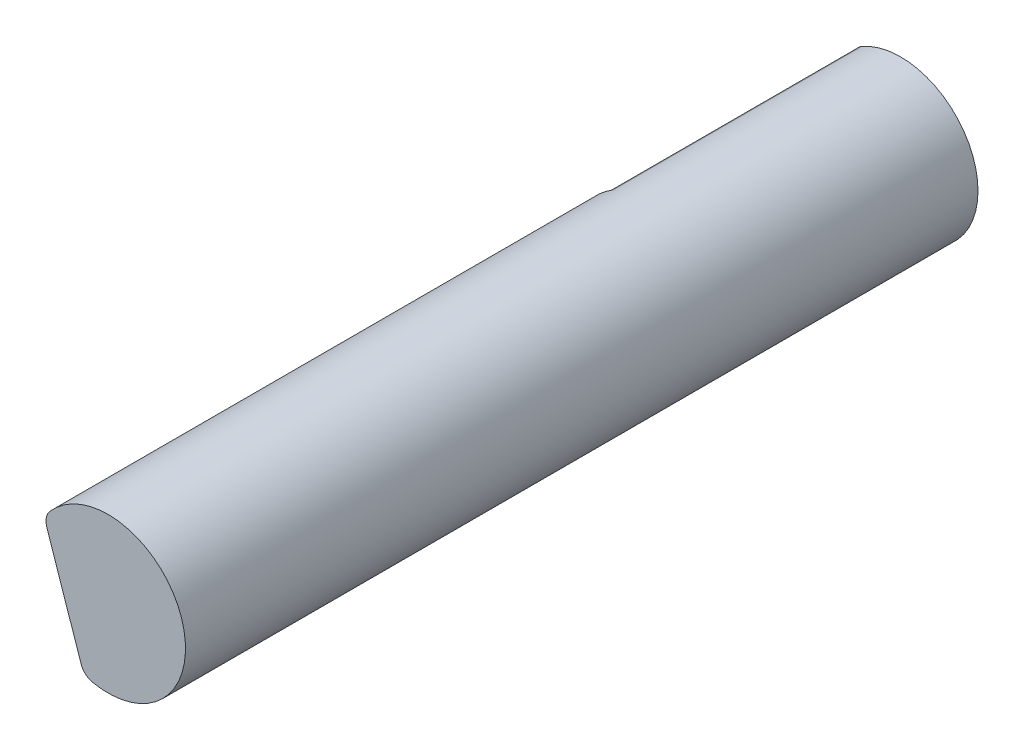
ISO-10303-21;
HEADER;
FILE_DESCRIPTION(('STEP AP214'),'2;1');
FILE_NAME('part.step','',(''),(''),'','','');
FILE_SCHEMA(('AUTOMOTIVE_DESIGN { 1 0 10303 214 1 1 1 1 }'));
ENDSEC;
DATA;
#1=APPLICATION_CONTEXT('core data for automotive mechanical design processes');
#2=APPLICATION_PROTOCOL_DEFINITION('international standard','automotive_design',2000,#1);
#3=PRODUCT_CONTEXT('',#1,'mechanical');
#4=PRODUCT('Part','Part','',(#3));
#5=PRODUCT_RELATED_PRODUCT_CATEGORY('part','',(#4));
#6=PRODUCT_DEFINITION_FORMATION('','',#4);
#7=PRODUCT_DEFINITION_CONTEXT('part definition',#1,'design');
#8=PRODUCT_DEFINITION('design','',#6,#7);
#9=PRODUCT_DEFINITION_SHAPE('','',#8);
#10=(LENGTH_UNIT() NAMED_UNIT(*) SI_UNIT(.MILLI.,.METRE.));
#11=(NAMED_UNIT(*) PLANE_ANGLE_UNIT() SI_UNIT($,.RADIAN.));
#12=(NAMED_UNIT(*) SI_UNIT($,.STERADIAN.) SOLID_ANGLE_UNIT());
#13=UNCERTAINTY_MEASURE_WITH_UNIT(LENGTH_MEASURE(1.E-05),#10,'distance_accuracy_value','');
#14=(GEOMETRIC_REPRESENTATION_CONTEXT(3) GLOBAL_UNCERTAINTY_ASSIGNED_CONTEXT((#13)) GLOBAL_UNIT_ASSIGNED_CONTEXT((#10,
#11,#12)) REPRESENTATION_CONTEXT('',''));
#15=CARTESIAN_POINT('',(0.,0.,0.));
#16=DIRECTION('',(0.,0.,1.));
#17=DIRECTION('',(1.,0.,0.));
#18=AXIS2_PLACEMENT_3D('',#15,#16,#17);
#19=CARTESIAN_POINT('',(0.,0.,50.));
#20=DIRECTION('',(0.,0.,-1.));
#21=DIRECTION('',(-1.,0.,0.));
#22=AXIS2_PLACEMENT_3D('',#19,#20,#21);
#23=CYLINDRICAL_SURFACE('',#22,4.98);
#24=CARTESIAN_POINT('',(0.,0.,16.));
#25=DIRECTION('',(0.,0.,-1.));
#26=DIRECTION('',(-1.,0.,0.));
#27=AXIS2_PLACEMENT_3D('',#24,#25,#26);
#28=CIRCLE('',#27,4.98);
#29=CARTESIAN_POINT('',(-2.50251256281407,-4.30555813721726,16.));
#30=VERTEX_POINT('',#29);
#31=CARTESIAN_POINT('',(-2.50251256281407,4.30555813721726,16.));
#32=VERTEX_POINT('',#31);
#33=EDGE_CURVE('E147',#30,#32,#28,.T.);
#34=ORIENTED_EDGE('',*,*,#33,.F.);
#35=DIRECTION('',(0.,0.,-1.));
#36=VECTOR('',#35,1.);
#37=CARTESIAN_POINT('',(-2.50251256281407,-4.30555813721726,50.));
#38=LINE('',#37,#36);
#39=CARTESIAN_POINT('',(-2.50251256281407,-4.30555813721726,0.));
#40=VERTEX_POINT('',#39);
#41=EDGE_CURVE('E116',#30,#40,#38,.T.);
#42=ORIENTED_EDGE('',*,*,#41,.T.);
#43=CARTESIAN_POINT('',(0.,0.,0.));
#44=DIRECTION('',(0.,0.,1.));
#45=DIRECTION('',(1.,0.,0.));
#46=AXIS2_PLACEMENT_3D('',#43,#44,#45);
#47=CIRCLE('',#46,4.98);
#48=CARTESIAN_POINT('',(-2.50251256281407,4.30555813721726,0.));
#49=VERTEX_POINT('',#48);
#50=EDGE_CURVE('E153',#40,#49,#47,.T.);
#51=ORIENTED_EDGE('',*,*,#50,.T.);
#52=DIRECTION('',(0.,0.,-1.));
#53=VECTOR('',#52,1.);
#54=CARTESIAN_POINT('',(-2.50251256281407,4.30555813721726,50.));
#55=LINE('',#54,#53);
#56=EDGE_CURVE('E159',#49,#32,#55,.F.);
#57=ORIENTED_EDGE('',*,*,#56,.T.);
#58=EDGE_LOOP('',(#34,#42,#51,#57));
#59=FACE_BOUND('',#58,.T.);
#60=CARTESIAN_POINT('',(0.,0.,34.));
#61=DIRECTION('',(0.,0.,1.));
#62=DIRECTION('',(1.,0.,0.));
#63=AXIS2_PLACEMENT_3D('',#60,#61,#62);
#64=CIRCLE('',#63,4.98);
#65=CARTESIAN_POINT('',(-3.74870290646182,3.27835728972372,34.));
#66=VERTEX_POINT('',#65);
#67=CARTESIAN_POINT('',(-0.993145698642784,-4.87996532992473,34.));
#68=VERTEX_POINT('',#67);
#69=EDGE_CURVE('E143',#66,#68,#64,.T.);
#70=ORIENTED_EDGE('',*,*,#69,.F.);
#71=DIRECTION('',(0.,0.,-1.));
#72=VECTOR('',#71,1.);
#73=CARTESIAN_POINT('',(-3.74870290646182,3.27835728972372,50.));
#74=LINE('',#73,#72);
#75=CARTESIAN_POINT('',(-3.74870290646183,3.27835728972372,51.));
#76=VERTEX_POINT('',#75);
#77=EDGE_CURVE('E115',#66,#76,#74,.F.);
#78=ORIENTED_EDGE('',*,*,#77,.T.);
#79=CARTESIAN_POINT('',(0.,0.,51.));
#80=DIRECTION('',(0.,0.,1.));
#81=DIRECTION('',(1.,0.,0.));
#82=AXIS2_PLACEMENT_3D('',#79,#80,#81);
#83=CIRCLE('',#82,4.98);
#84=CARTESIAN_POINT('',(-0.993145698642787,-4.87996532992472,51.));
#85=VERTEX_POINT('',#84);
#86=EDGE_CURVE('E119',#85,#76,#83,.T.);
#87=ORIENTED_EDGE('',*,*,#86,.F.);
#88=DIRECTION('',(0.,0.,-1.));
#89=VECTOR('',#88,1.);
#90=CARTESIAN_POINT('',(-0.993145698642784,-4.87996532992473,50.));
#91=LINE('',#90,#89);
#92=EDGE_CURVE('E106',#85,#68,#91,.T.);
#93=ORIENTED_EDGE('',*,*,#92,.T.);
#94=EDGE_LOOP('',(#70,#78,#87,#93));
#95=FACE_BOUND('',#94,.T.);
#96=ADVANCED_FACE('F40',(#59,#95),#23,.T.);
#97=CARTESIAN_POINT('',(0.,0.,0.));
#98=DIRECTION('',(0.,0.,1.));
#99=DIRECTION('',(1.,0.,0.));
#100=AXIS2_PLACEMENT_3D('',#97,#98,#99);
#101=PLANE('',#100);
#102=ORIENTED_EDGE('',*,*,#50,.F.);
#103=CARTESIAN_POINT('',(-2.,-3.44098823014552,0.));
#104=DIRECTION('',(0.,0.,1.));
#105=DIRECTION('',(1.,0.,0.));
#106=AXIS2_PLACEMENT_3D('',#103,#104,#105);
#107=CIRCLE('',#106,1.);
#108=CARTESIAN_POINT('',(-3.,-3.44098823014552,0.));
#109=VERTEX_POINT('',#108);
#110=EDGE_CURVE('E177',#40,#109,#107,.F.);
#111=ORIENTED_EDGE('',*,*,#110,.T.);
#112=DIRECTION('',(0.,-1.,0.));
#113=VECTOR('',#112,1.);
#114=CARTESIAN_POINT('',(-3.,0.,0.));
#115=LINE('',#114,#113);
#116=CARTESIAN_POINT('',(-3.,3.44098823014552,0.));
#117=VERTEX_POINT('',#116);
#118=EDGE_CURVE('E146',#117,#109,#115,.T.);
#119=ORIENTED_EDGE('',*,*,#118,.F.);
#120=CARTESIAN_POINT('',(-2.,3.44098823014552,0.));
#121=DIRECTION('',(0.,0.,1.));
#122=DIRECTION('',(1.,0.,0.));
#123=AXIS2_PLACEMENT_3D('',#120,#121,#122);
#124=CIRCLE('',#123,1.);
#125=EDGE_CURVE('E174',#117,#49,#124,.F.);
#126=ORIENTED_EDGE('',*,*,#125,.T.);
#127=EDGE_LOOP('',(#102,#111,#119,#126));
#128=FACE_BOUND('',#127,.T.);
#129=ADVANCED_FACE('F203',(#128),#101,.F.);
#130=CARTESIAN_POINT('',(-3.,0.,16.));
#131=DIRECTION('',(1.,0.,0.));
#132=DIRECTION('',(0.,0.,-1.));
#133=AXIS2_PLACEMENT_3D('',#130,#131,#132);
#134=PLANE('',#133);
#135=ORIENTED_EDGE('',*,*,#118,.T.);
#136=DIRECTION('',(0.,0.,-1.));
#137=VECTOR('',#136,1.);
#138=CARTESIAN_POINT('',(-3.,-3.44098823014552,16.));
#139=LINE('',#138,#137);
#140=CARTESIAN_POINT('',(-3.,-3.44098823014552,16.));
#141=VERTEX_POINT('',#140);
#142=EDGE_CURVE('E56',#109,#141,#139,.F.);
#143=ORIENTED_EDGE('',*,*,#142,.T.);
#144=DIRECTION('',(0.,-1.,0.));
#145=VECTOR('',#144,1.);
#146=CARTESIAN_POINT('',(-3.,0.,16.));
#147=LINE('',#146,#145);
#148=CARTESIAN_POINT('',(-3.,3.44098823014552,16.));
#149=VERTEX_POINT('',#148);
#150=EDGE_CURVE('E150',#149,#141,#147,.T.);
#151=ORIENTED_EDGE('',*,*,#150,.F.);
#152=DIRECTION('',(0.,0.,-1.));
#153=VECTOR('',#152,1.);
#154=CARTESIAN_POINT('',(-3.,3.44098823014552,16.));
#155=LINE('',#154,#153);
#156=EDGE_CURVE('E180',#149,#117,#155,.T.);
#157=ORIENTED_EDGE('',*,*,#156,.T.);
#158=EDGE_LOOP('',(#135,#143,#151,#157));
#159=FACE_BOUND('',#158,.T.);
#160=ADVANCED_FACE('F207',(#159),#134,.F.);
#161=CARTESIAN_POINT('',(0.,0.,16.));
#162=DIRECTION('',(0.,0.,-1.));
#163=DIRECTION('',(-1.,0.,0.));
#164=AXIS2_PLACEMENT_3D('',#161,#162,#163);
#165=PLANE('',#164);
#166=ORIENTED_EDGE('',*,*,#33,.T.);
#167=CARTESIAN_POINT('',(-2.,3.44098823014552,16.));
#168=DIRECTION('',(0.,0.,-1.));
#169=DIRECTION('',(-1.,0.,0.));
#170=AXIS2_PLACEMENT_3D('',#167,#168,#169);
#171=CIRCLE('',#170,1.);
#172=EDGE_CURVE('E11',#32,#149,#171,.F.);
#173=ORIENTED_EDGE('',*,*,#172,.T.);
#174=ORIENTED_EDGE('',*,*,#150,.T.);
#175=CARTESIAN_POINT('',(-2.,-3.44098823014552,16.));
#176=DIRECTION('',(0.,0.,-1.));
#177=DIRECTION('',(-1.,0.,0.));
#178=AXIS2_PLACEMENT_3D('',#175,#176,#177);
#179=CIRCLE('',#178,1.);
#180=EDGE_CURVE('E49',#141,#30,#179,.F.);
#181=ORIENTED_EDGE('',*,*,#180,.T.);
#182=EDGE_LOOP('',(#166,#173,#174,#181));
#183=FACE_BOUND('',#182,.T.);
#184=ADVANCED_FACE('F196',(#183),#165,.T.);
#185=CARTESIAN_POINT('',(-2.84225262775848,-0.959999999999998,34.));
#186=DIRECTION('',(-0.947417542586161,-0.319999999999999,0.));
#187=DIRECTION('',(0.319999999999999,-0.947417542586161,0.));
#188=AXIS2_PLACEMENT_3D('',#185,#186,#187);
#189=PLANE('',#188);
#190=DIRECTION('',(0.,0.,1.));
#191=VECTOR('',#190,1.);
#192=CARTESIAN_POINT('',(-1.74113639411192,-4.22005261307237,50.));
#193=LINE('',#192,#191);
#194=CARTESIAN_POINT('',(-1.74113639411192,-4.22005261307237,34.));
#195=VERTEX_POINT('',#194);
#196=CARTESIAN_POINT('',(-1.74113639411192,-4.22005261307237,51.));
#197=VERTEX_POINT('',#196);
#198=EDGE_CURVE('E168',#195,#197,#193,.T.);
#199=ORIENTED_EDGE('',*,*,#198,.T.);
#200=DIRECTION('',(0.319999999999999,-0.947417542586161,0.));
#201=VECTOR('',#200,1.);
#202=CARTESIAN_POINT('',(-3.94336886140505,2.30005261307237,51.));
#203=LINE('',#202,#201);
#204=CARTESIAN_POINT('',(-3.94336886140505,2.30005261307237,51.));
#205=VERTEX_POINT('',#204);
#206=EDGE_CURVE('E130',#205,#197,#203,.T.);
#207=ORIENTED_EDGE('',*,*,#206,.F.);
#208=DIRECTION('',(0.,0.,1.));
#209=VECTOR('',#208,1.);
#210=CARTESIAN_POINT('',(-3.94336886140505,2.30005261307237,34.));
#211=LINE('',#210,#209);
#212=CARTESIAN_POINT('',(-3.94336886140505,2.30005261307237,34.));
#213=VERTEX_POINT('',#212);
#214=EDGE_CURVE('E171',#205,#213,#211,.F.);
#215=ORIENTED_EDGE('',*,*,#214,.T.);
#216=DIRECTION('',(0.319999999999999,-0.947417542586161,0.));
#217=VECTOR('',#216,1.);
#218=CARTESIAN_POINT('',(-2.84225262775848,-0.959999999999998,34.));
#219=LINE('',#218,#217);
#220=EDGE_CURVE('E139',#213,#195,#219,.T.);
#221=ORIENTED_EDGE('',*,*,#220,.T.);
#222=EDGE_LOOP('',(#199,#207,#215,#221));
#223=FACE_BOUND('',#222,.T.);
#224=ADVANCED_FACE('F214',(#223),#189,.T.);
#225=CARTESIAN_POINT('',(0.,0.,34.));
#226=DIRECTION('',(0.,0.,1.));
#227=DIRECTION('',(1.,0.,0.));
#228=AXIS2_PLACEMENT_3D('',#225,#226,#227);
#229=PLANE('',#228);
#230=ORIENTED_EDGE('',*,*,#220,.F.);
#231=CARTESIAN_POINT('',(-2.99595131881889,2.62005261307237,34.));
#232=DIRECTION('',(0.,0.,1.));
#233=DIRECTION('',(1.,0.,0.));
#234=AXIS2_PLACEMENT_3D('',#231,#232,#233);
#235=CIRCLE('',#234,1.);
#236=EDGE_CURVE('E186',#213,#66,#235,.F.);
#237=ORIENTED_EDGE('',*,*,#236,.T.);
#238=ORIENTED_EDGE('',*,*,#69,.T.);
#239=CARTESIAN_POINT('',(-0.793718851525759,-3.90005261307237,34.));
#240=DIRECTION('',(0.,0.,1.));
#241=DIRECTION('',(1.,0.,0.));
#242=AXIS2_PLACEMENT_3D('',#239,#240,#241);
#243=CIRCLE('',#242,1.);
#244=EDGE_CURVE('E112',#68,#195,#243,.F.);
#245=ORIENTED_EDGE('',*,*,#244,.T.);
#246=EDGE_LOOP('',(#230,#237,#238,#245));
#247=FACE_BOUND('',#246,.T.);
#248=ADVANCED_FACE('F225',(#247),#229,.T.);
#249=CARTESIAN_POINT('',(-2.99595131881889,2.62005261307237,50.));
#250=DIRECTION('',(0.,0.,-1.));
#251=DIRECTION('',(-1.,0.,0.));
#252=AXIS2_PLACEMENT_3D('',#249,#250,#251);
#253=CYLINDRICAL_SURFACE('',#252,1.);
#254=ORIENTED_EDGE('',*,*,#236,.F.);
#255=ORIENTED_EDGE('',*,*,#214,.F.);
#256=CARTESIAN_POINT('',(-2.99595131881889,2.62005261307237,51.));
#257=DIRECTION('',(0.,0.,1.));
#258=DIRECTION('',(1.,0.,0.));
#259=AXIS2_PLACEMENT_3D('',#256,#257,#258);
#260=CIRCLE('',#259,1.);
#261=EDGE_CURVE('E125',#76,#205,#260,.T.);
#262=ORIENTED_EDGE('',*,*,#261,.F.);
#263=ORIENTED_EDGE('',*,*,#77,.F.);
#264=EDGE_LOOP('',(#254,#255,#262,#263));
#265=FACE_BOUND('',#264,.T.);
#266=ADVANCED_FACE('F222',(#265),#253,.T.);
#267=CARTESIAN_POINT('',(-0.793718851525759,-3.90005261307237,50.));
#268=DIRECTION('',(0.,0.,-1.));
#269=DIRECTION('',(-1.,0.,0.));
#270=AXIS2_PLACEMENT_3D('',#267,#268,#269);
#271=CYLINDRICAL_SURFACE('',#270,1.);
#272=ORIENTED_EDGE('',*,*,#244,.F.);
#273=ORIENTED_EDGE('',*,*,#92,.F.);
#274=CARTESIAN_POINT('',(-0.793718851525759,-3.90005261307237,51.));
#275=DIRECTION('',(0.,0.,1.));
#276=DIRECTION('',(1.,0.,0.));
#277=AXIS2_PLACEMENT_3D('',#274,#275,#276);
#278=CIRCLE('',#277,1.);
#279=EDGE_CURVE('E111',#197,#85,#278,.T.);
#280=ORIENTED_EDGE('',*,*,#279,.F.);
#281=ORIENTED_EDGE('',*,*,#198,.F.);
#282=EDGE_LOOP('',(#272,#273,#280,#281));
#283=FACE_BOUND('',#282,.T.);
#284=ADVANCED_FACE('F108',(#283),#271,.T.);
#285=CARTESIAN_POINT('',(-2.,-3.44098823014552,50.));
#286=DIRECTION('',(0.,0.,-1.));
#287=DIRECTION('',(-1.,0.,0.));
#288=AXIS2_PLACEMENT_3D('',#285,#286,#287);
#289=CYLINDRICAL_SURFACE('',#288,1.);
#290=ORIENTED_EDGE('',*,*,#180,.F.);
#291=ORIENTED_EDGE('',*,*,#142,.F.);
#292=ORIENTED_EDGE('',*,*,#110,.F.);
#293=ORIENTED_EDGE('',*,*,#41,.F.);
#294=EDGE_LOOP('',(#290,#291,#292,#293));
#295=FACE_BOUND('',#294,.T.);
#296=ADVANCED_FACE('F198',(#295),#289,.T.);
#297=CARTESIAN_POINT('',(-2.,3.44098823014552,50.));
#298=DIRECTION('',(0.,0.,-1.));
#299=DIRECTION('',(-1.,0.,0.));
#300=AXIS2_PLACEMENT_3D('',#297,#298,#299);
#301=CYLINDRICAL_SURFACE('',#300,1.);
#302=ORIENTED_EDGE('',*,*,#172,.F.);
#303=ORIENTED_EDGE('',*,*,#56,.F.);
#304=ORIENTED_EDGE('',*,*,#125,.F.);
#305=ORIENTED_EDGE('',*,*,#156,.F.);
#306=EDGE_LOOP('',(#302,#303,#304,#305));
#307=FACE_BOUND('',#306,.T.);
#308=ADVANCED_FACE('F42',(#307),#301,.T.);
#309=CARTESIAN_POINT('',(-0.793718851525759,-3.90005261307237,51.));
#310=DIRECTION('',(0.,0.,1.));
#311=DIRECTION('',(1.,0.,0.));
#312=AXIS2_PLACEMENT_3D('',#309,#310,#311);
#313=PLANE('',#312);
#314=ORIENTED_EDGE('',*,*,#279,.T.);
#315=ORIENTED_EDGE('',*,*,#86,.T.);
#316=ORIENTED_EDGE('',*,*,#261,.T.);
#317=ORIENTED_EDGE('',*,*,#206,.T.);
#318=EDGE_LOOP('',(#314,#315,#316,#317));
#319=FACE_BOUND('',#318,.T.);
#320=ADVANCED_FACE('F128',(#319),#313,.T.);
#321=CLOSED_SHELL('',(#96,#129,#160,#184,#224,#248,#266,#284,#296,#308,#320));
#322=MANIFOLD_SOLID_BREP('B2',#321);
#323=ADVANCED_BREP_SHAPE_REPRESENTATION('',(#18,#322),#14);
#324=SHAPE_DEFINITION_REPRESENTATION(#9,#323);
ENDSEC;
END-ISO-10303-21;
